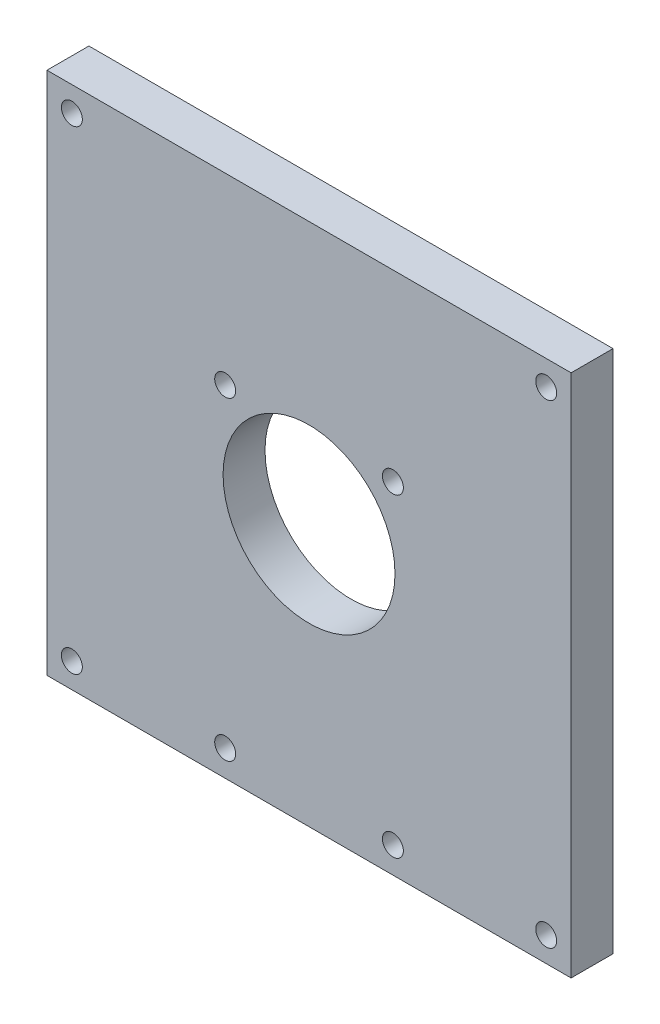
ISO-10303-21;
HEADER;
FILE_DESCRIPTION(('STEP AP214'),'2;1');
FILE_NAME('part.step','',(''),(''),'','','');
FILE_SCHEMA(('AUTOMOTIVE_DESIGN { 1 0 10303 214 1 1 1 1 }'));
ENDSEC;
DATA;
#1=APPLICATION_CONTEXT('core data for automotive mechanical design processes');
#2=APPLICATION_PROTOCOL_DEFINITION('international standard','automotive_design',2000,#1);
#3=PRODUCT_CONTEXT('',#1,'mechanical');
#4=PRODUCT('Part','Part','',(#3));
#5=PRODUCT_RELATED_PRODUCT_CATEGORY('part','',(#4));
#6=PRODUCT_DEFINITION_FORMATION('','',#4);
#7=PRODUCT_DEFINITION_CONTEXT('part definition',#1,'design');
#8=PRODUCT_DEFINITION('design','',#6,#7);
#9=PRODUCT_DEFINITION_SHAPE('','',#8);
#10=(LENGTH_UNIT() NAMED_UNIT(*) SI_UNIT(.MILLI.,.METRE.));
#11=(NAMED_UNIT(*) PLANE_ANGLE_UNIT() SI_UNIT($,.RADIAN.));
#12=(NAMED_UNIT(*) SI_UNIT($,.STERADIAN.) SOLID_ANGLE_UNIT());
#13=UNCERTAINTY_MEASURE_WITH_UNIT(LENGTH_MEASURE(1.E-05),#10,'distance_accuracy_value','');
#14=(GEOMETRIC_REPRESENTATION_CONTEXT(3) GLOBAL_UNCERTAINTY_ASSIGNED_CONTEXT((#13)) GLOBAL_UNIT_ASSIGNED_CONTEXT((#10,
#11,#12)) REPRESENTATION_CONTEXT('',''));
#15=CARTESIAN_POINT('',(0.,0.,0.));
#16=DIRECTION('',(0.,0.,1.));
#17=DIRECTION('',(1.,0.,0.));
#18=AXIS2_PLACEMENT_3D('',#15,#16,#17);
#19=CARTESIAN_POINT('',(0.,0.,4.));
#20=DIRECTION('',(0.,0.,-1.));
#21=DIRECTION('',(-1.,0.,0.));
#22=AXIS2_PLACEMENT_3D('',#19,#20,#21);
#23=PLANE('',#22);
#24=CARTESIAN_POINT('',(8.,-22.5,4.));
#25=DIRECTION('',(0.,0.,1.));
#26=DIRECTION('',(1.,0.,0.));
#27=AXIS2_PLACEMENT_3D('',#24,#25,#26);
#28=CIRCLE('',#27,1.);
#29=CARTESIAN_POINT('',(9.,-22.5,4.));
#30=VERTEX_POINT('',#29);
#31=EDGE_CURVE('E306',#30,#30,#28,.T.);
#32=ORIENTED_EDGE('',*,*,#31,.F.);
#33=EDGE_LOOP('',(#32));
#34=FACE_BOUND('',#33,.T.);
#35=CARTESIAN_POINT('',(-8.,-22.5,4.));
#36=DIRECTION('',(0.,0.,1.));
#37=DIRECTION('',(1.,0.,0.));
#38=AXIS2_PLACEMENT_3D('',#35,#36,#37);
#39=CIRCLE('',#38,1.);
#40=CARTESIAN_POINT('',(-7.,-22.5,4.));
#41=VERTEX_POINT('',#40);
#42=EDGE_CURVE('E307',#41,#41,#39,.T.);
#43=ORIENTED_EDGE('',*,*,#42,.F.);
#44=EDGE_LOOP('',(#43));
#45=FACE_BOUND('',#44,.T.);
#46=CARTESIAN_POINT('',(8.,7.5,4.));
#47=DIRECTION('',(0.,0.,1.));
#48=DIRECTION('',(1.,0.,0.));
#49=AXIS2_PLACEMENT_3D('',#46,#47,#48);
#50=CIRCLE('',#49,1.);
#51=CARTESIAN_POINT('',(9.,7.5,4.));
#52=VERTEX_POINT('',#51);
#53=EDGE_CURVE('E310',#52,#52,#50,.T.);
#54=ORIENTED_EDGE('',*,*,#53,.F.);
#55=EDGE_LOOP('',(#54));
#56=FACE_BOUND('',#55,.T.);
#57=CARTESIAN_POINT('',(-8.,7.5,4.));
#58=DIRECTION('',(0.,0.,1.));
#59=DIRECTION('',(1.,0.,0.));
#60=AXIS2_PLACEMENT_3D('',#57,#58,#59);
#61=CIRCLE('',#60,1.);
#62=CARTESIAN_POINT('',(-7.,7.5,4.));
#63=VERTEX_POINT('',#62);
#64=EDGE_CURVE('E314',#63,#63,#61,.T.);
#65=ORIENTED_EDGE('',*,*,#64,.F.);
#66=EDGE_LOOP('',(#65));
#67=FACE_BOUND('',#66,.T.);
#68=CARTESIAN_POINT('',(0.,0.,4.));
#69=DIRECTION('',(0.,0.,1.));
#70=DIRECTION('',(1.,0.,0.));
#71=AXIS2_PLACEMENT_3D('',#68,#69,#70);
#72=CIRCLE('',#71,8.2);
#73=CARTESIAN_POINT('',(8.2,0.,4.));
#74=VERTEX_POINT('',#73);
#75=EDGE_CURVE('E123',#74,#74,#72,.T.);
#76=ORIENTED_EDGE('',*,*,#75,.F.);
#77=EDGE_LOOP('',(#76));
#78=FACE_BOUND('',#77,.T.);
#79=DIRECTION('',(0.,1.,0.));
#80=VECTOR('',#79,1.);
#81=CARTESIAN_POINT('',(25.,-25.,4.));
#82=LINE('',#81,#80);
#83=CARTESIAN_POINT('',(25.,-25.,4.));
#84=VERTEX_POINT('',#83);
#85=CARTESIAN_POINT('',(25.,25.,4.));
#86=VERTEX_POINT('',#85);
#87=EDGE_CURVE('E97',#84,#86,#82,.T.);
#88=ORIENTED_EDGE('',*,*,#87,.T.);
#89=DIRECTION('',(-1.,0.,0.));
#90=VECTOR('',#89,1.);
#91=CARTESIAN_POINT('',(-25.,25.,4.));
#92=LINE('',#91,#90);
#93=CARTESIAN_POINT('',(-25.,25.,4.));
#94=VERTEX_POINT('',#93);
#95=EDGE_CURVE('E92',#86,#94,#92,.T.);
#96=ORIENTED_EDGE('',*,*,#95,.T.);
#97=DIRECTION('',(0.,-1.,0.));
#98=VECTOR('',#97,1.);
#99=CARTESIAN_POINT('',(-25.,-25.,4.));
#100=LINE('',#99,#98);
#101=CARTESIAN_POINT('',(-25.,-25.,4.));
#102=VERTEX_POINT('',#101);
#103=EDGE_CURVE('E95',#94,#102,#100,.T.);
#104=ORIENTED_EDGE('',*,*,#103,.T.);
#105=DIRECTION('',(1.,0.,0.));
#106=VECTOR('',#105,1.);
#107=CARTESIAN_POINT('',(-25.,-25.,4.));
#108=LINE('',#107,#106);
#109=EDGE_CURVE('E62',#102,#84,#108,.T.);
#110=ORIENTED_EDGE('',*,*,#109,.T.);
#111=EDGE_LOOP('',(#88,#96,#104,#110));
#112=FACE_BOUND('',#111,.T.);
#113=CARTESIAN_POINT('',(-22.6274169979695,22.6274169979695,4.));
#114=DIRECTION('',(0.,0.,1.));
#115=DIRECTION('',(1.,0.,0.));
#116=AXIS2_PLACEMENT_3D('',#113,#114,#115);
#117=CIRCLE('',#116,0.999999999999998);
#118=CARTESIAN_POINT('',(-21.6274169979695,22.6274169979695,4.));
#119=VERTEX_POINT('',#118);
#120=EDGE_CURVE('E113',#119,#119,#117,.T.);
#121=ORIENTED_EDGE('',*,*,#120,.F.);
#122=EDGE_LOOP('',(#121));
#123=FACE_BOUND('',#122,.T.);
#124=CARTESIAN_POINT('',(22.6274169979695,22.6274169979695,4.));
#125=DIRECTION('',(0.,0.,1.));
#126=DIRECTION('',(1.,0.,0.));
#127=AXIS2_PLACEMENT_3D('',#124,#125,#126);
#128=CIRCLE('',#127,0.999999999999998);
#129=CARTESIAN_POINT('',(23.6274169979695,22.6274169979695,4.));
#130=VERTEX_POINT('',#129);
#131=EDGE_CURVE('E152',#130,#130,#128,.T.);
#132=ORIENTED_EDGE('',*,*,#131,.F.);
#133=EDGE_LOOP('',(#132));
#134=FACE_BOUND('',#133,.T.);
#135=CARTESIAN_POINT('',(22.6274169979695,-22.6274169979695,4.));
#136=DIRECTION('',(0.,0.,1.));
#137=DIRECTION('',(1.,0.,0.));
#138=AXIS2_PLACEMENT_3D('',#135,#136,#137);
#139=CIRCLE('',#138,0.999999999999998);
#140=CARTESIAN_POINT('',(23.6274169979695,-22.6274169979695,4.));
#141=VERTEX_POINT('',#140);
#142=EDGE_CURVE('E146',#141,#141,#139,.T.);
#143=ORIENTED_EDGE('',*,*,#142,.F.);
#144=EDGE_LOOP('',(#143));
#145=FACE_BOUND('',#144,.T.);
#146=CARTESIAN_POINT('',(-22.6274169979695,-22.6274169979695,4.));
#147=DIRECTION('',(0.,0.,1.));
#148=DIRECTION('',(1.,0.,0.));
#149=AXIS2_PLACEMENT_3D('',#146,#147,#148);
#150=CIRCLE('',#149,0.999999999999998);
#151=CARTESIAN_POINT('',(-21.6274169979695,-22.6274169979695,4.));
#152=VERTEX_POINT('',#151);
#153=EDGE_CURVE('E137',#152,#152,#150,.T.);
#154=ORIENTED_EDGE('',*,*,#153,.F.);
#155=EDGE_LOOP('',(#154));
#156=FACE_BOUND('',#155,.T.);
#157=ADVANCED_FACE('F43',(#34,#45,#56,#67,#78,#112,#123,#134,#145,#156),#23,.F.);
#158=CARTESIAN_POINT('',(0.,0.,0.));
#159=DIRECTION('',(0.,0.,-1.));
#160=DIRECTION('',(-1.,0.,0.));
#161=AXIS2_PLACEMENT_3D('',#158,#159,#160);
#162=PLANE('',#161);
#163=CARTESIAN_POINT('',(8.,-22.5,0.));
#164=DIRECTION('',(0.,0.,-1.));
#165=DIRECTION('',(-1.,0.,0.));
#166=AXIS2_PLACEMENT_3D('',#163,#164,#165);
#167=CIRCLE('',#166,1.);
#168=CARTESIAN_POINT('',(6.99999999999999,-22.5,0.));
#169=VERTEX_POINT('',#168);
#170=EDGE_CURVE('E47',#169,#169,#167,.T.);
#171=ORIENTED_EDGE('',*,*,#170,.F.);
#172=EDGE_LOOP('',(#171));
#173=FACE_BOUND('',#172,.T.);
#174=CARTESIAN_POINT('',(-8.,-22.5,0.));
#175=DIRECTION('',(0.,0.,-1.));
#176=DIRECTION('',(-1.,0.,0.));
#177=AXIS2_PLACEMENT_3D('',#174,#175,#176);
#178=CIRCLE('',#177,1.);
#179=CARTESIAN_POINT('',(-9.,-22.5,0.));
#180=VERTEX_POINT('',#179);
#181=EDGE_CURVE('E128',#180,#180,#178,.T.);
#182=ORIENTED_EDGE('',*,*,#181,.F.);
#183=EDGE_LOOP('',(#182));
#184=FACE_BOUND('',#183,.T.);
#185=CARTESIAN_POINT('',(8.,7.5,0.));
#186=DIRECTION('',(0.,0.,-1.));
#187=DIRECTION('',(-1.,0.,0.));
#188=AXIS2_PLACEMENT_3D('',#185,#186,#187);
#189=CIRCLE('',#188,1.);
#190=CARTESIAN_POINT('',(7.,7.5,0.));
#191=VERTEX_POINT('',#190);
#192=EDGE_CURVE('E126',#191,#191,#189,.T.);
#193=ORIENTED_EDGE('',*,*,#192,.F.);
#194=EDGE_LOOP('',(#193));
#195=FACE_BOUND('',#194,.T.);
#196=CARTESIAN_POINT('',(-8.,7.5,0.));
#197=DIRECTION('',(0.,0.,-1.));
#198=DIRECTION('',(-1.,0.,0.));
#199=AXIS2_PLACEMENT_3D('',#196,#197,#198);
#200=CIRCLE('',#199,1.);
#201=CARTESIAN_POINT('',(-9.,7.5,0.));
#202=VERTEX_POINT('',#201);
#203=EDGE_CURVE('E122',#202,#202,#200,.T.);
#204=ORIENTED_EDGE('',*,*,#203,.F.);
#205=EDGE_LOOP('',(#204));
#206=FACE_BOUND('',#205,.T.);
#207=CARTESIAN_POINT('',(0.,0.,0.));
#208=DIRECTION('',(0.,0.,-1.));
#209=DIRECTION('',(-1.,0.,0.));
#210=AXIS2_PLACEMENT_3D('',#207,#208,#209);
#211=CIRCLE('',#210,8.2);
#212=CARTESIAN_POINT('',(-8.2,0.,0.));
#213=VERTEX_POINT('',#212);
#214=EDGE_CURVE('E119',#213,#213,#211,.T.);
#215=ORIENTED_EDGE('',*,*,#214,.F.);
#216=EDGE_LOOP('',(#215));
#217=FACE_BOUND('',#216,.T.);
#218=CARTESIAN_POINT('',(22.6274169979695,-22.6274169979695,0.));
#219=DIRECTION('',(0.,0.,1.));
#220=DIRECTION('',(1.,0.,0.));
#221=AXIS2_PLACEMENT_3D('',#218,#219,#220);
#222=CIRCLE('',#221,0.999999999999998);
#223=CARTESIAN_POINT('',(23.6274169979695,-22.6274169979695,0.));
#224=VERTEX_POINT('',#223);
#225=EDGE_CURVE('E142',#224,#224,#222,.T.);
#226=ORIENTED_EDGE('',*,*,#225,.T.);
#227=EDGE_LOOP('',(#226));
#228=FACE_BOUND('',#227,.T.);
#229=CARTESIAN_POINT('',(-22.6274169979695,22.6274169979695,0.));
#230=DIRECTION('',(0.,0.,1.));
#231=DIRECTION('',(1.,0.,0.));
#232=AXIS2_PLACEMENT_3D('',#229,#230,#231);
#233=CIRCLE('',#232,0.999999999999998);
#234=CARTESIAN_POINT('',(-21.6274169979695,22.6274169979695,0.));
#235=VERTEX_POINT('',#234);
#236=EDGE_CURVE('E155',#235,#235,#233,.T.);
#237=ORIENTED_EDGE('',*,*,#236,.T.);
#238=EDGE_LOOP('',(#237));
#239=FACE_BOUND('',#238,.T.);
#240=DIRECTION('',(0.,1.,0.));
#241=VECTOR('',#240,1.);
#242=CARTESIAN_POINT('',(25.,-25.,0.));
#243=LINE('',#242,#241);
#244=CARTESIAN_POINT('',(25.,-25.,0.));
#245=VERTEX_POINT('',#244);
#246=CARTESIAN_POINT('',(25.,25.,0.));
#247=VERTEX_POINT('',#246);
#248=EDGE_CURVE('E110',#245,#247,#243,.T.);
#249=ORIENTED_EDGE('',*,*,#248,.F.);
#250=DIRECTION('',(1.,0.,0.));
#251=VECTOR('',#250,1.);
#252=CARTESIAN_POINT('',(-25.,-25.,0.));
#253=LINE('',#252,#251);
#254=CARTESIAN_POINT('',(-25.,-25.,0.));
#255=VERTEX_POINT('',#254);
#256=EDGE_CURVE('E85',#255,#245,#253,.T.);
#257=ORIENTED_EDGE('',*,*,#256,.F.);
#258=DIRECTION('',(0.,-1.,0.));
#259=VECTOR('',#258,1.);
#260=CARTESIAN_POINT('',(-25.,-25.,0.));
#261=LINE('',#260,#259);
#262=CARTESIAN_POINT('',(-25.,25.,0.));
#263=VERTEX_POINT('',#262);
#264=EDGE_CURVE('E79',#263,#255,#261,.T.);
#265=ORIENTED_EDGE('',*,*,#264,.F.);
#266=DIRECTION('',(-1.,0.,0.));
#267=VECTOR('',#266,1.);
#268=CARTESIAN_POINT('',(-25.,25.,0.));
#269=LINE('',#268,#267);
#270=EDGE_CURVE('E101',#247,#263,#269,.T.);
#271=ORIENTED_EDGE('',*,*,#270,.F.);
#272=EDGE_LOOP('',(#249,#257,#265,#271));
#273=FACE_BOUND('',#272,.T.);
#274=CARTESIAN_POINT('',(22.6274169979695,22.6274169979695,0.));
#275=DIRECTION('',(0.,0.,1.));
#276=DIRECTION('',(1.,0.,0.));
#277=AXIS2_PLACEMENT_3D('',#274,#275,#276);
#278=CIRCLE('',#277,0.999999999999998);
#279=CARTESIAN_POINT('',(23.6274169979695,22.6274169979695,0.));
#280=VERTEX_POINT('',#279);
#281=EDGE_CURVE('E149',#280,#280,#278,.T.);
#282=ORIENTED_EDGE('',*,*,#281,.T.);
#283=EDGE_LOOP('',(#282));
#284=FACE_BOUND('',#283,.T.);
#285=CARTESIAN_POINT('',(-22.6274169979695,-22.6274169979695,0.));
#286=DIRECTION('',(0.,0.,1.));
#287=DIRECTION('',(1.,0.,0.));
#288=AXIS2_PLACEMENT_3D('',#285,#286,#287);
#289=CIRCLE('',#288,0.999999999999998);
#290=CARTESIAN_POINT('',(-21.6274169979695,-22.6274169979695,0.));
#291=VERTEX_POINT('',#290);
#292=EDGE_CURVE('E133',#291,#291,#289,.T.);
#293=ORIENTED_EDGE('',*,*,#292,.T.);
#294=EDGE_LOOP('',(#293));
#295=FACE_BOUND('',#294,.T.);
#296=ADVANCED_FACE('F163',(#173,#184,#195,#206,#217,#228,#239,#273,#284,#295),#162,.T.);
#297=CARTESIAN_POINT('',(25.,-25.,4.));
#298=DIRECTION('',(-1.,0.,0.));
#299=DIRECTION('',(0.,0.,1.));
#300=AXIS2_PLACEMENT_3D('',#297,#298,#299);
#301=PLANE('',#300);
#302=ORIENTED_EDGE('',*,*,#248,.T.);
#303=DIRECTION('',(0.,0.,-1.));
#304=VECTOR('',#303,1.);
#305=CARTESIAN_POINT('',(25.,25.,4.));
#306=LINE('',#305,#304);
#307=EDGE_CURVE('E11',#86,#247,#306,.T.);
#308=ORIENTED_EDGE('',*,*,#307,.F.);
#309=ORIENTED_EDGE('',*,*,#87,.F.);
#310=DIRECTION('',(0.,0.,-1.));
#311=VECTOR('',#310,1.);
#312=CARTESIAN_POINT('',(25.,-25.,4.));
#313=LINE('',#312,#311);
#314=EDGE_CURVE('E106',#84,#245,#313,.T.);
#315=ORIENTED_EDGE('',*,*,#314,.T.);
#316=EDGE_LOOP('',(#302,#308,#309,#315));
#317=FACE_BOUND('',#316,.T.);
#318=ADVANCED_FACE('F45',(#317),#301,.F.);
#319=CARTESIAN_POINT('',(-25.,25.,4.));
#320=DIRECTION('',(0.,-1.,0.));
#321=DIRECTION('',(0.,0.,-1.));
#322=AXIS2_PLACEMENT_3D('',#319,#320,#321);
#323=PLANE('',#322);
#324=ORIENTED_EDGE('',*,*,#270,.T.);
#325=DIRECTION('',(0.,0.,-1.));
#326=VECTOR('',#325,1.);
#327=CARTESIAN_POINT('',(-25.,25.,4.));
#328=LINE('',#327,#326);
#329=EDGE_CURVE('E53',#94,#263,#328,.T.);
#330=ORIENTED_EDGE('',*,*,#329,.F.);
#331=ORIENTED_EDGE('',*,*,#95,.F.);
#332=ORIENTED_EDGE('',*,*,#307,.T.);
#333=EDGE_LOOP('',(#324,#330,#331,#332));
#334=FACE_BOUND('',#333,.T.);
#335=ADVANCED_FACE('F100',(#334),#323,.F.);
#336=CARTESIAN_POINT('',(-25.,-25.,4.));
#337=DIRECTION('',(1.,0.,0.));
#338=DIRECTION('',(0.,0.,-1.));
#339=AXIS2_PLACEMENT_3D('',#336,#337,#338);
#340=PLANE('',#339);
#341=ORIENTED_EDGE('',*,*,#264,.T.);
#342=DIRECTION('',(0.,0.,-1.));
#343=VECTOR('',#342,1.);
#344=CARTESIAN_POINT('',(-25.,-25.,4.));
#345=LINE('',#344,#343);
#346=EDGE_CURVE('E102',#102,#255,#345,.T.);
#347=ORIENTED_EDGE('',*,*,#346,.F.);
#348=ORIENTED_EDGE('',*,*,#103,.F.);
#349=ORIENTED_EDGE('',*,*,#329,.T.);
#350=EDGE_LOOP('',(#341,#347,#348,#349));
#351=FACE_BOUND('',#350,.T.);
#352=ADVANCED_FACE('F104',(#351),#340,.F.);
#353=CARTESIAN_POINT('',(-25.,-25.,4.));
#354=DIRECTION('',(0.,1.,0.));
#355=DIRECTION('',(0.,0.,1.));
#356=AXIS2_PLACEMENT_3D('',#353,#354,#355);
#357=PLANE('',#356);
#358=ORIENTED_EDGE('',*,*,#256,.T.);
#359=ORIENTED_EDGE('',*,*,#314,.F.);
#360=ORIENTED_EDGE('',*,*,#109,.F.);
#361=ORIENTED_EDGE('',*,*,#346,.T.);
#362=EDGE_LOOP('',(#358,#359,#360,#361));
#363=FACE_BOUND('',#362,.T.);
#364=ADVANCED_FACE('F169',(#363),#357,.F.);
#365=CARTESIAN_POINT('',(-22.6274169979695,22.6274169979695,4.));
#366=DIRECTION('',(0.,0.,-1.));
#367=DIRECTION('',(-1.,0.,0.));
#368=AXIS2_PLACEMENT_3D('',#365,#366,#367);
#369=CYLINDRICAL_SURFACE('',#368,0.999999999999998);
#370=ORIENTED_EDGE('',*,*,#120,.T.);
#371=EDGE_LOOP('',(#370));
#372=FACE_BOUND('',#371,.T.);
#373=ORIENTED_EDGE('',*,*,#236,.F.);
#374=EDGE_LOOP('',(#373));
#375=FACE_BOUND('',#374,.T.);
#376=ADVANCED_FACE('F166',(#372,#375),#369,.F.);
#377=CARTESIAN_POINT('',(22.6274169979695,22.6274169979695,4.));
#378=DIRECTION('',(0.,0.,-1.));
#379=DIRECTION('',(-1.,0.,0.));
#380=AXIS2_PLACEMENT_3D('',#377,#378,#379);
#381=CYLINDRICAL_SURFACE('',#380,0.999999999999998);
#382=ORIENTED_EDGE('',*,*,#131,.T.);
#383=EDGE_LOOP('',(#382));
#384=FACE_BOUND('',#383,.T.);
#385=ORIENTED_EDGE('',*,*,#281,.F.);
#386=EDGE_LOOP('',(#385));
#387=FACE_BOUND('',#386,.T.);
#388=ADVANCED_FACE('F168',(#384,#387),#381,.F.);
#389=CARTESIAN_POINT('',(22.6274169979695,-22.6274169979695,4.));
#390=DIRECTION('',(0.,0.,-1.));
#391=DIRECTION('',(-1.,0.,0.));
#392=AXIS2_PLACEMENT_3D('',#389,#390,#391);
#393=CYLINDRICAL_SURFACE('',#392,0.999999999999998);
#394=ORIENTED_EDGE('',*,*,#142,.T.);
#395=EDGE_LOOP('',(#394));
#396=FACE_BOUND('',#395,.T.);
#397=ORIENTED_EDGE('',*,*,#225,.F.);
#398=EDGE_LOOP('',(#397));
#399=FACE_BOUND('',#398,.T.);
#400=ADVANCED_FACE('F176',(#396,#399),#393,.F.);
#401=CARTESIAN_POINT('',(-22.6274169979695,-22.6274169979695,4.));
#402=DIRECTION('',(0.,0.,-1.));
#403=DIRECTION('',(-1.,0.,0.));
#404=AXIS2_PLACEMENT_3D('',#401,#402,#403);
#405=CYLINDRICAL_SURFACE('',#404,0.999999999999998);
#406=ORIENTED_EDGE('',*,*,#153,.T.);
#407=EDGE_LOOP('',(#406));
#408=FACE_BOUND('',#407,.T.);
#409=ORIENTED_EDGE('',*,*,#292,.F.);
#410=EDGE_LOOP('',(#409));
#411=FACE_BOUND('',#410,.T.);
#412=ADVANCED_FACE('F244',(#408,#411),#405,.F.);
#413=CARTESIAN_POINT('',(0.,0.,-6.));
#414=DIRECTION('',(0.,0.,1.));
#415=DIRECTION('',(1.,0.,0.));
#416=AXIS2_PLACEMENT_3D('',#413,#414,#415);
#417=CYLINDRICAL_SURFACE('',#416,8.2);
#418=ORIENTED_EDGE('',*,*,#214,.T.);
#419=EDGE_LOOP('',(#418));
#420=FACE_BOUND('',#419,.T.);
#421=ORIENTED_EDGE('',*,*,#75,.T.);
#422=EDGE_LOOP('',(#421));
#423=FACE_BOUND('',#422,.T.);
#424=ADVANCED_FACE('F253',(#420,#423),#417,.F.);
#425=CARTESIAN_POINT('',(-8.,7.5,-6.));
#426=DIRECTION('',(0.,0.,1.));
#427=DIRECTION('',(1.,0.,0.));
#428=AXIS2_PLACEMENT_3D('',#425,#426,#427);
#429=CYLINDRICAL_SURFACE('',#428,1.);
#430=ORIENTED_EDGE('',*,*,#203,.T.);
#431=EDGE_LOOP('',(#430));
#432=FACE_BOUND('',#431,.T.);
#433=ORIENTED_EDGE('',*,*,#64,.T.);
#434=EDGE_LOOP('',(#433));
#435=FACE_BOUND('',#434,.T.);
#436=ADVANCED_FACE('F263',(#432,#435),#429,.F.);
#437=CARTESIAN_POINT('',(8.,7.5,-6.));
#438=DIRECTION('',(0.,0.,1.));
#439=DIRECTION('',(1.,0.,0.));
#440=AXIS2_PLACEMENT_3D('',#437,#438,#439);
#441=CYLINDRICAL_SURFACE('',#440,1.);
#442=ORIENTED_EDGE('',*,*,#192,.T.);
#443=EDGE_LOOP('',(#442));
#444=FACE_BOUND('',#443,.T.);
#445=ORIENTED_EDGE('',*,*,#53,.T.);
#446=EDGE_LOOP('',(#445));
#447=FACE_BOUND('',#446,.T.);
#448=ADVANCED_FACE('F273',(#444,#447),#441,.F.);
#449=CARTESIAN_POINT('',(-8.,-22.5,-6.));
#450=DIRECTION('',(0.,0.,1.));
#451=DIRECTION('',(1.,0.,0.));
#452=AXIS2_PLACEMENT_3D('',#449,#450,#451);
#453=CYLINDRICAL_SURFACE('',#452,1.);
#454=ORIENTED_EDGE('',*,*,#181,.T.);
#455=EDGE_LOOP('',(#454));
#456=FACE_BOUND('',#455,.T.);
#457=ORIENTED_EDGE('',*,*,#42,.T.);
#458=EDGE_LOOP('',(#457));
#459=FACE_BOUND('',#458,.T.);
#460=ADVANCED_FACE('F283',(#456,#459),#453,.F.);
#461=CARTESIAN_POINT('',(8.,-22.5,-6.));
#462=DIRECTION('',(0.,0.,1.));
#463=DIRECTION('',(1.,0.,0.));
#464=AXIS2_PLACEMENT_3D('',#461,#462,#463);
#465=CYLINDRICAL_SURFACE('',#464,1.);
#466=ORIENTED_EDGE('',*,*,#170,.T.);
#467=EDGE_LOOP('',(#466));
#468=FACE_BOUND('',#467,.T.);
#469=ORIENTED_EDGE('',*,*,#31,.T.);
#470=EDGE_LOOP('',(#469));
#471=FACE_BOUND('',#470,.T.);
#472=ADVANCED_FACE('F293',(#468,#471),#465,.F.);
#473=CLOSED_SHELL('',(#157,#296,#318,#335,#352,#364,#376,#388,#400,#412,#424,#436,#448,#460,#472));
#474=MANIFOLD_SOLID_BREP('B2',#473);
#475=ADVANCED_BREP_SHAPE_REPRESENTATION('',(#18,#474),#14);
#476=SHAPE_DEFINITION_REPRESENTATION(#9,#475);
ENDSEC;
END-ISO-10303-21;
